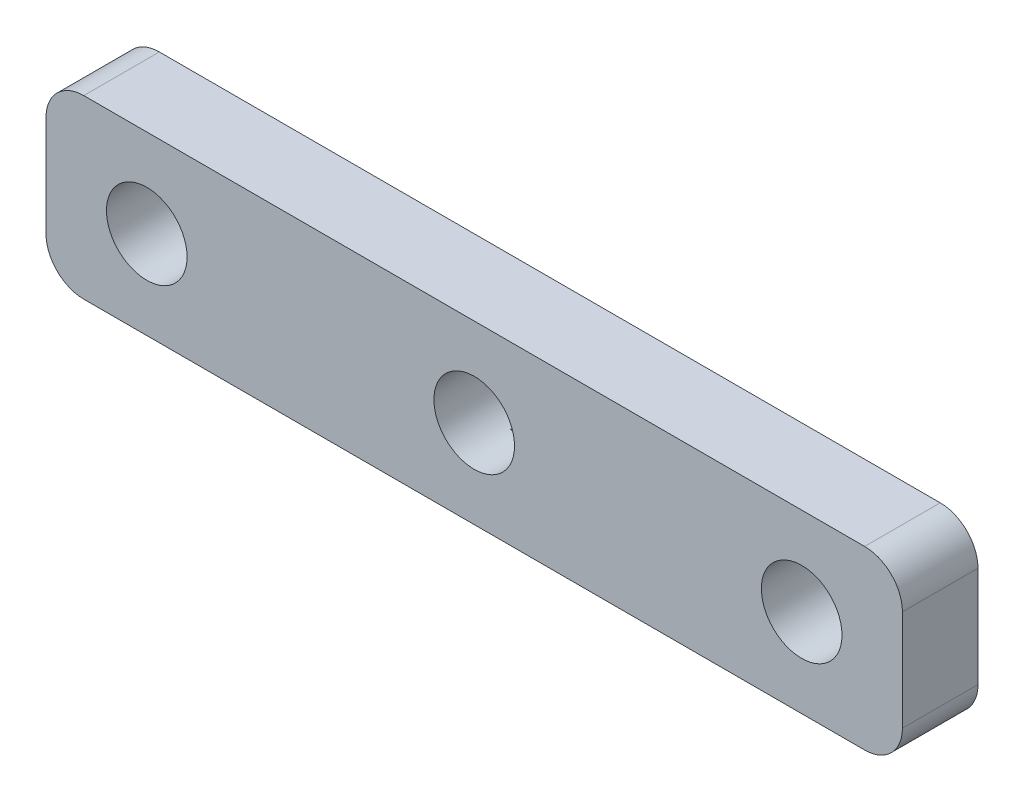
ISO-10303-21;
HEADER;
FILE_DESCRIPTION(('STEP AP214'),'2;1');
FILE_NAME('part.step','',(''),(''),'','','');
FILE_SCHEMA(('AUTOMOTIVE_DESIGN { 1 0 10303 214 1 1 1 1 }'));
ENDSEC;
DATA;
#1=APPLICATION_CONTEXT('core data for automotive mechanical design processes');
#2=APPLICATION_PROTOCOL_DEFINITION('international standard','automotive_design',2000,#1);
#3=PRODUCT_CONTEXT('',#1,'mechanical');
#4=PRODUCT('Part','Part','',(#3));
#5=PRODUCT_RELATED_PRODUCT_CATEGORY('part','',(#4));
#6=PRODUCT_DEFINITION_FORMATION('','',#4);
#7=PRODUCT_DEFINITION_CONTEXT('part definition',#1,'design');
#8=PRODUCT_DEFINITION('design','',#6,#7);
#9=PRODUCT_DEFINITION_SHAPE('','',#8);
#10=(LENGTH_UNIT() NAMED_UNIT(*) SI_UNIT(.MILLI.,.METRE.));
#11=(NAMED_UNIT(*) PLANE_ANGLE_UNIT() SI_UNIT($,.RADIAN.));
#12=(NAMED_UNIT(*) SI_UNIT($,.STERADIAN.) SOLID_ANGLE_UNIT());
#13=UNCERTAINTY_MEASURE_WITH_UNIT(LENGTH_MEASURE(1.E-05),#10,'distance_accuracy_value','');
#14=(GEOMETRIC_REPRESENTATION_CONTEXT(3) GLOBAL_UNCERTAINTY_ASSIGNED_CONTEXT((#13)) GLOBAL_UNIT_ASSIGNED_CONTEXT((#10,
#11,#12)) REPRESENTATION_CONTEXT('',''));
#15=CARTESIAN_POINT('',(0.,0.,0.));
#16=DIRECTION('',(0.,0.,1.));
#17=DIRECTION('',(1.,0.,0.));
#18=AXIS2_PLACEMENT_3D('',#15,#16,#17);
#19=CARTESIAN_POINT('',(0.,0.,3.));
#20=DIRECTION('',(0.,0.,-1.));
#21=DIRECTION('',(-1.,0.,0.));
#22=AXIS2_PLACEMENT_3D('',#19,#20,#21);
#23=PLANE('',#22);
#24=DIRECTION('',(0.,-1.,0.));
#25=VECTOR('',#24,1.);
#26=CARTESIAN_POINT('',(0.,0.,3.));
#27=LINE('',#26,#25);
#28=CARTESIAN_POINT('',(0.,5.5,3.));
#29=VERTEX_POINT('',#28);
#30=CARTESIAN_POINT('',(0.,1.5,3.));
#31=VERTEX_POINT('',#30);
#32=EDGE_CURVE('E354',#29,#31,#27,.T.);
#33=ORIENTED_EDGE('',*,*,#32,.T.);
#34=CARTESIAN_POINT('',(1.5,1.5,3.));
#35=DIRECTION('',(0.,0.,-1.));
#36=DIRECTION('',(-1.,0.,0.));
#37=AXIS2_PLACEMENT_3D('',#34,#35,#36);
#38=CIRCLE('',#37,1.5);
#39=CARTESIAN_POINT('',(1.5,0.,3.));
#40=VERTEX_POINT('',#39);
#41=EDGE_CURVE('E425',#31,#40,#38,.F.);
#42=ORIENTED_EDGE('',*,*,#41,.T.);
#43=DIRECTION('',(1.,0.,0.));
#44=VECTOR('',#43,1.);
#45=CARTESIAN_POINT('',(0.,0.,3.));
#46=LINE('',#45,#44);
#47=CARTESIAN_POINT('',(32.5000000000008,0.,3.));
#48=VERTEX_POINT('',#47);
#49=EDGE_CURVE('E357',#40,#48,#46,.T.);
#50=ORIENTED_EDGE('',*,*,#49,.T.);
#51=CARTESIAN_POINT('',(32.5000000000008,1.5,3.));
#52=DIRECTION('',(0.,0.,-1.));
#53=DIRECTION('',(-1.,0.,0.));
#54=AXIS2_PLACEMENT_3D('',#51,#52,#53);
#55=CIRCLE('',#54,1.5);
#56=CARTESIAN_POINT('',(34.0000000000008,1.5,3.));
#57=VERTEX_POINT('',#56);
#58=EDGE_CURVE('E421',#48,#57,#55,.F.);
#59=ORIENTED_EDGE('',*,*,#58,.T.);
#60=DIRECTION('',(0.,1.,0.));
#61=VECTOR('',#60,1.);
#62=CARTESIAN_POINT('',(34.0000000000008,0.,3.));
#63=LINE('',#62,#61);
#64=CARTESIAN_POINT('',(34.0000000000008,5.5,3.));
#65=VERTEX_POINT('',#64);
#66=EDGE_CURVE('E361',#57,#65,#63,.T.);
#67=ORIENTED_EDGE('',*,*,#66,.T.);
#68=CARTESIAN_POINT('',(32.5000000000008,5.5,3.));
#69=DIRECTION('',(0.,0.,-1.));
#70=DIRECTION('',(-1.,0.,0.));
#71=AXIS2_PLACEMENT_3D('',#68,#69,#70);
#72=CIRCLE('',#71,1.5);
#73=CARTESIAN_POINT('',(32.5000000000008,7.,3.));
#74=VERTEX_POINT('',#73);
#75=EDGE_CURVE('E55',#65,#74,#72,.F.);
#76=ORIENTED_EDGE('',*,*,#75,.T.);
#77=DIRECTION('',(-1.,0.,0.));
#78=VECTOR('',#77,1.);
#79=CARTESIAN_POINT('',(0.,7.,3.));
#80=LINE('',#79,#78);
#81=CARTESIAN_POINT('',(1.5,7.,3.));
#82=VERTEX_POINT('',#81);
#83=EDGE_CURVE('E363',#74,#82,#80,.T.);
#84=ORIENTED_EDGE('',*,*,#83,.T.);
#85=CARTESIAN_POINT('',(1.5,5.5,3.));
#86=DIRECTION('',(0.,0.,-1.));
#87=DIRECTION('',(-1.,0.,0.));
#88=AXIS2_PLACEMENT_3D('',#85,#86,#87);
#89=CIRCLE('',#88,1.5);
#90=EDGE_CURVE('E423',#82,#29,#89,.F.);
#91=ORIENTED_EDGE('',*,*,#90,.T.);
#92=EDGE_LOOP('',(#33,#42,#50,#59,#67,#76,#84,#91));
#93=FACE_BOUND('',#92,.T.);
#94=CARTESIAN_POINT('',(3.99999999999866,3.50000000000078,3.));
#95=DIRECTION('',(0.,0.,1.));
#96=DIRECTION('',(1.,0.,0.));
#97=AXIS2_PLACEMENT_3D('',#94,#95,#96);
#98=CIRCLE('',#97,1.60000000000105);
#99=CARTESIAN_POINT('',(5.59999999999971,3.50000000000078,3.));
#100=VERTEX_POINT('',#99);
#101=EDGE_CURVE('E348',#100,#100,#98,.T.);
#102=ORIENTED_EDGE('',*,*,#101,.F.);
#103=EDGE_LOOP('',(#102));
#104=FACE_BOUND('',#103,.T.);
#105=CARTESIAN_POINT('',(29.9999999999987,3.50000000000078,3.));
#106=DIRECTION('',(0.,0.,1.));
#107=DIRECTION('',(1.,0.,0.));
#108=AXIS2_PLACEMENT_3D('',#105,#106,#107);
#109=CIRCLE('',#108,1.60000000000105);
#110=CARTESIAN_POINT('',(31.5999999999997,3.50000000000078,3.));
#111=VERTEX_POINT('',#110);
#112=EDGE_CURVE('E342',#111,#111,#109,.T.);
#113=ORIENTED_EDGE('',*,*,#112,.F.);
#114=EDGE_LOOP('',(#113));
#115=FACE_BOUND('',#114,.T.);
#116=CARTESIAN_POINT('',(16.9999999999987,3.50000000000078,3.));
#117=DIRECTION('',(0.,0.,1.));
#118=DIRECTION('',(1.,0.,0.));
#119=AXIS2_PLACEMENT_3D('',#116,#117,#118);
#120=CIRCLE('',#119,1.60000000000105);
#121=CARTESIAN_POINT('',(18.5999999999997,3.50000000000078,3.));
#122=VERTEX_POINT('',#121);
#123=EDGE_CURVE('E334',#122,#122,#120,.T.);
#124=ORIENTED_EDGE('',*,*,#123,.F.);
#125=EDGE_LOOP('',(#124));
#126=FACE_BOUND('',#125,.T.);
#127=ADVANCED_FACE('F33',(#93,#104,#115,#126),#23,.F.);
#128=CARTESIAN_POINT('',(0.,0.,0.));
#129=DIRECTION('',(0.,0.,-1.));
#130=DIRECTION('',(-1.,0.,0.));
#131=AXIS2_PLACEMENT_3D('',#128,#129,#130);
#132=PLANE('',#131);
#133=DIRECTION('',(-1.,0.,0.));
#134=VECTOR('',#133,1.);
#135=CARTESIAN_POINT('',(26.0000000000008,5.,0.));
#136=LINE('',#135,#134);
#137=CARTESIAN_POINT('',(26.0000000000008,5.,0.));
#138=VERTEX_POINT('',#137);
#139=CARTESIAN_POINT('',(17.5567764362868,5.,0.));
#140=VERTEX_POINT('',#139);
#141=EDGE_CURVE('E252',#138,#140,#136,.T.);
#142=ORIENTED_EDGE('',*,*,#141,.F.);
#143=DIRECTION('',(0.,-1.,0.));
#144=VECTOR('',#143,1.);
#145=CARTESIAN_POINT('',(26.0000000000008,5.,0.));
#146=LINE('',#145,#144);
#147=CARTESIAN_POINT('',(26.0000000000008,6.,0.));
#148=VERTEX_POINT('',#147);
#149=EDGE_CURVE('E231',#148,#138,#146,.T.);
#150=ORIENTED_EDGE('',*,*,#149,.F.);
#151=DIRECTION('',(1.,0.,0.));
#152=VECTOR('',#151,1.);
#153=CARTESIAN_POINT('',(26.0000000000008,6.,0.));
#154=LINE('',#153,#152);
#155=CARTESIAN_POINT('',(8.,6.00000000000001,0.));
#156=VERTEX_POINT('',#155);
#157=EDGE_CURVE('E256',#156,#148,#154,.T.);
#158=ORIENTED_EDGE('',*,*,#157,.F.);
#159=DIRECTION('',(0.,1.,0.));
#160=VECTOR('',#159,1.);
#161=CARTESIAN_POINT('',(8.,5.,0.));
#162=LINE('',#161,#160);
#163=CARTESIAN_POINT('',(8.,5.,0.));
#164=VERTEX_POINT('',#163);
#165=EDGE_CURVE('E254',#164,#156,#162,.T.);
#166=ORIENTED_EDGE('',*,*,#165,.F.);
#167=CARTESIAN_POINT('',(16.4432235637105,5.,0.));
#168=VERTEX_POINT('',#167);
#169=EDGE_CURVE('E237',#168,#164,#136,.T.);
#170=ORIENTED_EDGE('',*,*,#169,.F.);
#171=CARTESIAN_POINT('',(16.9999999999987,3.50000000000078,0.));
#172=DIRECTION('',(0.,0.,1.));
#173=DIRECTION('',(1.,0.,0.));
#174=AXIS2_PLACEMENT_3D('',#171,#172,#173);
#175=CIRCLE('',#174,1.60000000000105);
#176=CARTESIAN_POINT('',(15.4801315846402,4.,0.));
#177=VERTEX_POINT('',#176);
#178=EDGE_CURVE('E341',#168,#177,#175,.T.);
#179=ORIENTED_EDGE('',*,*,#178,.T.);
#180=DIRECTION('',(1.,0.,0.));
#181=VECTOR('',#180,1.);
#182=CARTESIAN_POINT('',(26.0000000000008,4.,0.));
#183=LINE('',#182,#181);
#184=CARTESIAN_POINT('',(8.,4.00000000000001,0.));
#185=VERTEX_POINT('',#184);
#186=EDGE_CURVE('E287',#185,#177,#183,.T.);
#187=ORIENTED_EDGE('',*,*,#186,.F.);
#188=DIRECTION('',(0.,1.,0.));
#189=VECTOR('',#188,1.);
#190=CARTESIAN_POINT('',(8.,3.,0.));
#191=LINE('',#190,#189);
#192=CARTESIAN_POINT('',(8.,3.,0.));
#193=VERTEX_POINT('',#192);
#194=EDGE_CURVE('E282',#193,#185,#191,.T.);
#195=ORIENTED_EDGE('',*,*,#194,.F.);
#196=DIRECTION('',(-1.,0.,0.));
#197=VECTOR('',#196,1.);
#198=CARTESIAN_POINT('',(26.0000000000008,3.,0.));
#199=LINE('',#198,#197);
#200=CARTESIAN_POINT('',(15.4801315846407,3.,0.));
#201=VERTEX_POINT('',#200);
#202=EDGE_CURVE('E283',#201,#193,#199,.T.);
#203=ORIENTED_EDGE('',*,*,#202,.F.);
#204=CARTESIAN_POINT('',(16.4432235637147,2.,0.));
#205=VERTEX_POINT('',#204);
#206=EDGE_CURVE('E767',#201,#205,#175,.T.);
#207=ORIENTED_EDGE('',*,*,#206,.T.);
#208=DIRECTION('',(1.,0.,0.));
#209=VECTOR('',#208,1.);
#210=CARTESIAN_POINT('',(26.0000000000008,2.,0.));
#211=LINE('',#210,#209);
#212=CARTESIAN_POINT('',(8.,2.00000000000001,0.));
#213=VERTEX_POINT('',#212);
#214=EDGE_CURVE('E322',#213,#205,#211,.T.);
#215=ORIENTED_EDGE('',*,*,#214,.F.);
#216=DIRECTION('',(0.,1.,0.));
#217=VECTOR('',#216,1.);
#218=CARTESIAN_POINT('',(8.,1.,0.));
#219=LINE('',#218,#217);
#220=CARTESIAN_POINT('',(8.,1.,0.));
#221=VERTEX_POINT('',#220);
#222=EDGE_CURVE('E318',#221,#213,#219,.T.);
#223=ORIENTED_EDGE('',*,*,#222,.F.);
#224=DIRECTION('',(-1.,0.,0.));
#225=VECTOR('',#224,1.);
#226=CARTESIAN_POINT('',(26.0000000000008,1.,0.));
#227=LINE('',#226,#225);
#228=CARTESIAN_POINT('',(26.0000000000008,1.,0.));
#229=VERTEX_POINT('',#228);
#230=EDGE_CURVE('E315',#229,#221,#227,.T.);
#231=ORIENTED_EDGE('',*,*,#230,.F.);
#232=DIRECTION('',(0.,-1.,0.));
#233=VECTOR('',#232,1.);
#234=CARTESIAN_POINT('',(26.0000000000008,1.,0.));
#235=LINE('',#234,#233);
#236=CARTESIAN_POINT('',(26.0000000000008,2.,0.));
#237=VERTEX_POINT('',#236);
#238=EDGE_CURVE('E305',#237,#229,#235,.T.);
#239=ORIENTED_EDGE('',*,*,#238,.F.);
#240=CARTESIAN_POINT('',(17.5567764362826,2.,0.));
#241=VERTEX_POINT('',#240);
#242=EDGE_CURVE('E321',#241,#237,#211,.T.);
#243=ORIENTED_EDGE('',*,*,#242,.F.);
#244=CARTESIAN_POINT('',(18.5198684153566,3.,0.));
#245=VERTEX_POINT('',#244);
#246=EDGE_CURVE('E263',#241,#245,#175,.T.);
#247=ORIENTED_EDGE('',*,*,#246,.T.);
#248=CARTESIAN_POINT('',(26.0000000000008,3.,0.));
#249=VERTEX_POINT('',#248);
#250=EDGE_CURVE('E280',#249,#245,#199,.T.);
#251=ORIENTED_EDGE('',*,*,#250,.F.);
#252=DIRECTION('',(0.,-1.,0.));
#253=VECTOR('',#252,1.);
#254=CARTESIAN_POINT('',(26.0000000000008,3.,0.));
#255=LINE('',#254,#253);
#256=CARTESIAN_POINT('',(26.0000000000008,4.,0.));
#257=VERTEX_POINT('',#256);
#258=EDGE_CURVE('E289',#257,#249,#255,.T.);
#259=ORIENTED_EDGE('',*,*,#258,.F.);
#260=CARTESIAN_POINT('',(18.5198684153571,4.,0.));
#261=VERTEX_POINT('',#260);
#262=EDGE_CURVE('E286',#261,#257,#183,.T.);
#263=ORIENTED_EDGE('',*,*,#262,.F.);
#264=EDGE_CURVE('E338',#261,#140,#175,.T.);
#265=ORIENTED_EDGE('',*,*,#264,.T.);
#266=EDGE_LOOP('',(#142,#150,#158,#166,#170,#179,#187,#195,#203,#207,#215,#223,#231,#239,#243,
#247,#251,#259,#263,#265));
#267=FACE_BOUND('',#266,.T.);
#268=CARTESIAN_POINT('',(29.9999999999987,3.50000000000078,0.));
#269=DIRECTION('',(0.,0.,1.));
#270=DIRECTION('',(1.,0.,0.));
#271=AXIS2_PLACEMENT_3D('',#268,#269,#270);
#272=CIRCLE('',#271,1.60000000000105);
#273=CARTESIAN_POINT('',(31.5999999999997,3.50000000000078,0.));
#274=VERTEX_POINT('',#273);
#275=EDGE_CURVE('E337',#274,#274,#272,.T.);
#276=ORIENTED_EDGE('',*,*,#275,.T.);
#277=EDGE_LOOP('',(#276));
#278=FACE_BOUND('',#277,.T.);
#279=DIRECTION('',(1.,0.,0.));
#280=VECTOR('',#279,1.);
#281=CARTESIAN_POINT('',(0.,0.,0.));
#282=LINE('',#281,#280);
#283=CARTESIAN_POINT('',(1.5,0.,0.));
#284=VERTEX_POINT('',#283);
#285=CARTESIAN_POINT('',(32.5000000000008,0.,0.));
#286=VERTEX_POINT('',#285);
#287=EDGE_CURVE('E368',#284,#286,#282,.T.);
#288=ORIENTED_EDGE('',*,*,#287,.F.);
#289=CARTESIAN_POINT('',(1.5,1.5,0.));
#290=DIRECTION('',(0.,0.,-1.));
#291=DIRECTION('',(-1.,0.,0.));
#292=AXIS2_PLACEMENT_3D('',#289,#290,#291);
#293=CIRCLE('',#292,1.5);
#294=CARTESIAN_POINT('',(0.,1.5,0.));
#295=VERTEX_POINT('',#294);
#296=EDGE_CURVE('E413',#284,#295,#293,.T.);
#297=ORIENTED_EDGE('',*,*,#296,.T.);
#298=DIRECTION('',(0.,-1.,0.));
#299=VECTOR('',#298,1.);
#300=CARTESIAN_POINT('',(0.,0.,0.));
#301=LINE('',#300,#299);
#302=CARTESIAN_POINT('',(0.,5.5,0.));
#303=VERTEX_POINT('',#302);
#304=EDGE_CURVE('E351',#303,#295,#301,.T.);
#305=ORIENTED_EDGE('',*,*,#304,.F.);
#306=CARTESIAN_POINT('',(1.5,5.5,0.));
#307=DIRECTION('',(0.,0.,-1.));
#308=DIRECTION('',(-1.,0.,0.));
#309=AXIS2_PLACEMENT_3D('',#306,#307,#308);
#310=CIRCLE('',#309,1.5);
#311=CARTESIAN_POINT('',(1.5,7.,0.));
#312=VERTEX_POINT('',#311);
#313=EDGE_CURVE('E411',#303,#312,#310,.T.);
#314=ORIENTED_EDGE('',*,*,#313,.T.);
#315=DIRECTION('',(-1.,0.,0.));
#316=VECTOR('',#315,1.);
#317=CARTESIAN_POINT('',(0.,7.,0.));
#318=LINE('',#317,#316);
#319=CARTESIAN_POINT('',(32.5000000000008,7.,0.));
#320=VERTEX_POINT('',#319);
#321=EDGE_CURVE('E358',#320,#312,#318,.T.);
#322=ORIENTED_EDGE('',*,*,#321,.F.);
#323=CARTESIAN_POINT('',(32.5000000000008,5.5,0.));
#324=DIRECTION('',(0.,0.,-1.));
#325=DIRECTION('',(-1.,0.,0.));
#326=AXIS2_PLACEMENT_3D('',#323,#324,#325);
#327=CIRCLE('',#326,1.5);
#328=CARTESIAN_POINT('',(34.0000000000008,5.5,0.));
#329=VERTEX_POINT('',#328);
#330=EDGE_CURVE('E407',#320,#329,#327,.T.);
#331=ORIENTED_EDGE('',*,*,#330,.T.);
#332=DIRECTION('',(0.,1.,0.));
#333=VECTOR('',#332,1.);
#334=CARTESIAN_POINT('',(34.0000000000008,0.,0.));
#335=LINE('',#334,#333);
#336=CARTESIAN_POINT('',(34.0000000000008,1.5,0.));
#337=VERTEX_POINT('',#336);
#338=EDGE_CURVE('E371',#337,#329,#335,.T.);
#339=ORIENTED_EDGE('',*,*,#338,.F.);
#340=CARTESIAN_POINT('',(32.5000000000008,1.5,0.));
#341=DIRECTION('',(0.,0.,-1.));
#342=DIRECTION('',(-1.,0.,0.));
#343=AXIS2_PLACEMENT_3D('',#340,#341,#342);
#344=CIRCLE('',#343,1.5);
#345=EDGE_CURVE('E409',#337,#286,#344,.T.);
#346=ORIENTED_EDGE('',*,*,#345,.T.);
#347=EDGE_LOOP('',(#288,#297,#305,#314,#322,#331,#339,#346));
#348=FACE_BOUND('',#347,.T.);
#349=CARTESIAN_POINT('',(3.99999999999866,3.50000000000078,0.));
#350=DIRECTION('',(0.,0.,1.));
#351=DIRECTION('',(1.,0.,0.));
#352=AXIS2_PLACEMENT_3D('',#349,#350,#351);
#353=CIRCLE('',#352,1.60000000000105);
#354=CARTESIAN_POINT('',(5.59999999999971,3.50000000000078,0.));
#355=VERTEX_POINT('',#354);
#356=EDGE_CURVE('E345',#355,#355,#353,.T.);
#357=ORIENTED_EDGE('',*,*,#356,.T.);
#358=EDGE_LOOP('',(#357));
#359=FACE_BOUND('',#358,.T.);
#360=ADVANCED_FACE('F444',(#267,#278,#348,#359),#132,.T.);
#361=CARTESIAN_POINT('',(0.,0.,3.));
#362=DIRECTION('',(1.,0.,0.));
#363=DIRECTION('',(0.,0.,-1.));
#364=AXIS2_PLACEMENT_3D('',#361,#362,#363);
#365=PLANE('',#364);
#366=ORIENTED_EDGE('',*,*,#304,.T.);
#367=DIRECTION('',(0.,0.,-1.));
#368=VECTOR('',#367,1.);
#369=CARTESIAN_POINT('',(0.,1.5,3.));
#370=LINE('',#369,#368);
#371=EDGE_CURVE('E418',#295,#31,#370,.F.);
#372=ORIENTED_EDGE('',*,*,#371,.T.);
#373=ORIENTED_EDGE('',*,*,#32,.F.);
#374=DIRECTION('',(0.,0.,-1.));
#375=VECTOR('',#374,1.);
#376=CARTESIAN_POINT('',(0.,5.5,3.));
#377=LINE('',#376,#375);
#378=EDGE_CURVE('E415',#29,#303,#377,.T.);
#379=ORIENTED_EDGE('',*,*,#378,.T.);
#380=EDGE_LOOP('',(#366,#372,#373,#379));
#381=FACE_BOUND('',#380,.T.);
#382=ADVANCED_FACE('F453',(#381),#365,.F.);
#383=CARTESIAN_POINT('',(0.,0.,3.));
#384=DIRECTION('',(0.,1.,0.));
#385=DIRECTION('',(0.,0.,1.));
#386=AXIS2_PLACEMENT_3D('',#383,#384,#385);
#387=PLANE('',#386);
#388=ORIENTED_EDGE('',*,*,#49,.F.);
#389=DIRECTION('',(0.,0.,-1.));
#390=VECTOR('',#389,1.);
#391=CARTESIAN_POINT('',(1.5,0.,3.));
#392=LINE('',#391,#390);
#393=EDGE_CURVE('E404',#40,#284,#392,.T.);
#394=ORIENTED_EDGE('',*,*,#393,.T.);
#395=ORIENTED_EDGE('',*,*,#287,.T.);
#396=DIRECTION('',(0.,0.,-1.));
#397=VECTOR('',#396,1.);
#398=CARTESIAN_POINT('',(32.5000000000008,0.,3.));
#399=LINE('',#398,#397);
#400=EDGE_CURVE('E402',#286,#48,#399,.F.);
#401=ORIENTED_EDGE('',*,*,#400,.T.);
#402=EDGE_LOOP('',(#388,#394,#395,#401));
#403=FACE_BOUND('',#402,.T.);
#404=ADVANCED_FACE('F461',(#403),#387,.F.);
#405=CARTESIAN_POINT('',(34.0000000000008,0.,3.));
#406=DIRECTION('',(-1.,0.,0.));
#407=DIRECTION('',(0.,0.,1.));
#408=AXIS2_PLACEMENT_3D('',#405,#406,#407);
#409=PLANE('',#408);
#410=ORIENTED_EDGE('',*,*,#66,.F.);
#411=DIRECTION('',(0.,0.,-1.));
#412=VECTOR('',#411,1.);
#413=CARTESIAN_POINT('',(34.0000000000008,1.5,3.));
#414=LINE('',#413,#412);
#415=EDGE_CURVE('E11',#57,#337,#414,.T.);
#416=ORIENTED_EDGE('',*,*,#415,.T.);
#417=ORIENTED_EDGE('',*,*,#338,.T.);
#418=DIRECTION('',(0.,0.,-1.));
#419=VECTOR('',#418,1.);
#420=CARTESIAN_POINT('',(34.0000000000008,5.5,3.));
#421=LINE('',#420,#419);
#422=EDGE_CURVE('E41',#329,#65,#421,.F.);
#423=ORIENTED_EDGE('',*,*,#422,.T.);
#424=EDGE_LOOP('',(#410,#416,#417,#423));
#425=FACE_BOUND('',#424,.T.);
#426=ADVANCED_FACE('F433',(#425),#409,.F.);
#427=CARTESIAN_POINT('',(0.,7.,3.));
#428=DIRECTION('',(0.,-1.,0.));
#429=DIRECTION('',(0.,0.,-1.));
#430=AXIS2_PLACEMENT_3D('',#427,#428,#429);
#431=PLANE('',#430);
#432=ORIENTED_EDGE('',*,*,#321,.T.);
#433=DIRECTION('',(0.,0.,-1.));
#434=VECTOR('',#433,1.);
#435=CARTESIAN_POINT('',(1.5,7.,3.));
#436=LINE('',#435,#434);
#437=EDGE_CURVE('E48',#312,#82,#436,.F.);
#438=ORIENTED_EDGE('',*,*,#437,.T.);
#439=ORIENTED_EDGE('',*,*,#83,.F.);
#440=DIRECTION('',(0.,0.,-1.));
#441=VECTOR('',#440,1.);
#442=CARTESIAN_POINT('',(32.5000000000008,7.,3.));
#443=LINE('',#442,#441);
#444=EDGE_CURVE('E427',#74,#320,#443,.T.);
#445=ORIENTED_EDGE('',*,*,#444,.T.);
#446=EDGE_LOOP('',(#432,#438,#439,#445));
#447=FACE_BOUND('',#446,.T.);
#448=ADVANCED_FACE('F441',(#447),#431,.F.);
#449=CARTESIAN_POINT('',(3.99999999999866,3.50000000000078,3.));
#450=DIRECTION('',(0.,0.,-1.));
#451=DIRECTION('',(-1.,0.,0.));
#452=AXIS2_PLACEMENT_3D('',#449,#450,#451);
#453=CYLINDRICAL_SURFACE('',#452,1.60000000000105);
#454=ORIENTED_EDGE('',*,*,#101,.T.);
#455=EDGE_LOOP('',(#454));
#456=FACE_BOUND('',#455,.T.);
#457=ORIENTED_EDGE('',*,*,#356,.F.);
#458=EDGE_LOOP('',(#457));
#459=FACE_BOUND('',#458,.T.);
#460=ADVANCED_FACE('F479',(#456,#459),#453,.F.);
#461=CARTESIAN_POINT('',(29.9999999999987,3.50000000000078,3.));
#462=DIRECTION('',(0.,0.,-1.));
#463=DIRECTION('',(-1.,0.,0.));
#464=AXIS2_PLACEMENT_3D('',#461,#462,#463);
#465=CYLINDRICAL_SURFACE('',#464,1.60000000000105);
#466=ORIENTED_EDGE('',*,*,#112,.T.);
#467=EDGE_LOOP('',(#466));
#468=FACE_BOUND('',#467,.T.);
#469=ORIENTED_EDGE('',*,*,#275,.F.);
#470=EDGE_LOOP('',(#469));
#471=FACE_BOUND('',#470,.T.);
#472=ADVANCED_FACE('F558',(#468,#471),#465,.F.);
#473=CARTESIAN_POINT('',(16.9999999999987,3.50000000000078,3.));
#474=DIRECTION('',(0.,0.,-1.));
#475=DIRECTION('',(-1.,0.,0.));
#476=AXIS2_PLACEMENT_3D('',#473,#474,#475);
#477=CYLINDRICAL_SURFACE('',#476,1.60000000000105);
#478=DIRECTION('',(0.,0.,-1.));
#479=VECTOR('',#478,1.);
#480=CARTESIAN_POINT('',(16.4432235637105,5.,3.));
#481=LINE('',#480,#479);
#482=CARTESIAN_POINT('',(16.4432235637105,5.,1.));
#483=VERTEX_POINT('',#482);
#484=EDGE_CURVE('E400',#483,#168,#481,.T.);
#485=ORIENTED_EDGE('',*,*,#484,.F.);
#486=CARTESIAN_POINT('',(16.9999999999987,3.50000000000078,1.));
#487=DIRECTION('',(0.,0.,-1.));
#488=DIRECTION('',(-1.,0.,0.));
#489=AXIS2_PLACEMENT_3D('',#486,#487,#488);
#490=CIRCLE('',#489,1.60000000000105);
#491=CARTESIAN_POINT('',(17.5567764362868,5.,1.));
#492=VERTEX_POINT('',#491);
#493=EDGE_CURVE('E227',#483,#492,#490,.T.);
#494=ORIENTED_EDGE('',*,*,#493,.T.);
#495=DIRECTION('',(0.,0.,-1.));
#496=VECTOR('',#495,1.);
#497=CARTESIAN_POINT('',(17.5567764362868,5.,3.));
#498=LINE('',#497,#496);
#499=EDGE_CURVE('E397',#140,#492,#498,.F.);
#500=ORIENTED_EDGE('',*,*,#499,.F.);
#501=ORIENTED_EDGE('',*,*,#264,.F.);
#502=DIRECTION('',(0.,0.,-1.));
#503=VECTOR('',#502,1.);
#504=CARTESIAN_POINT('',(18.5198684153571,4.,3.));
#505=LINE('',#504,#503);
#506=CARTESIAN_POINT('',(18.5198684153571,4.,1.));
#507=VERTEX_POINT('',#506);
#508=EDGE_CURVE('E391',#507,#261,#505,.T.);
#509=ORIENTED_EDGE('',*,*,#508,.F.);
#510=CARTESIAN_POINT('',(16.9999999999987,3.50000000000078,1.));
#511=DIRECTION('',(0.,0.,-1.));
#512=DIRECTION('',(-1.,0.,0.));
#513=AXIS2_PLACEMENT_3D('',#510,#511,#512);
#514=CIRCLE('',#513,1.60000000000105);
#515=CARTESIAN_POINT('',(18.5198684153566,3.,1.));
#516=VERTEX_POINT('',#515);
#517=EDGE_CURVE('E386',#507,#516,#514,.T.);
#518=ORIENTED_EDGE('',*,*,#517,.T.);
#519=DIRECTION('',(0.,0.,-1.));
#520=VECTOR('',#519,1.);
#521=CARTESIAN_POINT('',(18.5198684153566,3.,3.));
#522=LINE('',#521,#520);
#523=EDGE_CURVE('E393',#245,#516,#522,.F.);
#524=ORIENTED_EDGE('',*,*,#523,.F.);
#525=ORIENTED_EDGE('',*,*,#246,.F.);
#526=DIRECTION('',(0.,0.,-1.));
#527=VECTOR('',#526,1.);
#528=CARTESIAN_POINT('',(17.5567764362826,2.,3.));
#529=LINE('',#528,#527);
#530=CARTESIAN_POINT('',(17.5567764362826,2.,1.));
#531=VERTEX_POINT('',#530);
#532=EDGE_CURVE('E380',#531,#241,#529,.T.);
#533=ORIENTED_EDGE('',*,*,#532,.F.);
#534=CARTESIAN_POINT('',(16.9999999999987,3.50000000000078,1.));
#535=DIRECTION('',(0.,0.,-1.));
#536=DIRECTION('',(-1.,0.,0.));
#537=AXIS2_PLACEMENT_3D('',#534,#535,#536);
#538=CIRCLE('',#537,1.60000000000105);
#539=CARTESIAN_POINT('',(16.4432235637147,2.,1.));
#540=VERTEX_POINT('',#539);
#541=EDGE_CURVE('E365',#531,#540,#538,.T.);
#542=ORIENTED_EDGE('',*,*,#541,.T.);
#543=DIRECTION('',(0.,0.,-1.));
#544=VECTOR('',#543,1.);
#545=CARTESIAN_POINT('',(16.4432235637147,2.,3.));
#546=LINE('',#545,#544);
#547=EDGE_CURVE('E377',#205,#540,#546,.F.);
#548=ORIENTED_EDGE('',*,*,#547,.F.);
#549=ORIENTED_EDGE('',*,*,#206,.F.);
#550=DIRECTION('',(0.,0.,-1.));
#551=VECTOR('',#550,1.);
#552=CARTESIAN_POINT('',(15.4801315846407,3.,3.));
#553=LINE('',#552,#551);
#554=CARTESIAN_POINT('',(15.4801315846407,3.,1.));
#555=VERTEX_POINT('',#554);
#556=EDGE_CURVE('E389',#555,#201,#553,.T.);
#557=ORIENTED_EDGE('',*,*,#556,.F.);
#558=CARTESIAN_POINT('',(15.4801315846402,4.,1.));
#559=VERTEX_POINT('',#558);
#560=EDGE_CURVE('E382',#555,#559,#514,.T.);
#561=ORIENTED_EDGE('',*,*,#560,.T.);
#562=DIRECTION('',(0.,0.,-1.));
#563=VECTOR('',#562,1.);
#564=CARTESIAN_POINT('',(15.4801315846402,4.,3.));
#565=LINE('',#564,#563);
#566=EDGE_CURVE('E385',#177,#559,#565,.F.);
#567=ORIENTED_EDGE('',*,*,#566,.F.);
#568=ORIENTED_EDGE('',*,*,#178,.F.);
#569=EDGE_LOOP('',(#485,#494,#500,#501,#509,#518,#524,#525,#533,#542,#548,#549,#557,#561,#567,#568));
#570=FACE_BOUND('',#569,.T.);
#571=ORIENTED_EDGE('',*,*,#123,.T.);
#572=EDGE_LOOP('',(#571));
#573=FACE_BOUND('',#572,.T.);
#574=ADVANCED_FACE('F556',(#570,#573),#477,.F.);
#575=CARTESIAN_POINT('',(26.0000000000008,2.,1.));
#576=DIRECTION('',(0.,1.,0.));
#577=DIRECTION('',(-1.,0.,0.));
#578=AXIS2_PLACEMENT_3D('',#575,#576,#577);
#579=PLANE('',#578);
#580=ORIENTED_EDGE('',*,*,#532,.T.);
#581=ORIENTED_EDGE('',*,*,#242,.T.);
#582=DIRECTION('',(0.,0.,-1.));
#583=VECTOR('',#582,1.);
#584=CARTESIAN_POINT('',(26.0000000000008,2.,1.));
#585=LINE('',#584,#583);
#586=CARTESIAN_POINT('',(26.0000000000008,2.,1.));
#587=VERTEX_POINT('',#586);
#588=EDGE_CURVE('E328',#587,#237,#585,.T.);
#589=ORIENTED_EDGE('',*,*,#588,.F.);
#590=DIRECTION('',(1.,0.,0.));
#591=VECTOR('',#590,1.);
#592=CARTESIAN_POINT('',(26.0000000000008,2.,1.));
#593=LINE('',#592,#591);
#594=EDGE_CURVE('E308',#531,#587,#593,.T.);
#595=ORIENTED_EDGE('',*,*,#594,.F.);
#596=EDGE_LOOP('',(#580,#581,#589,#595));
#597=FACE_BOUND('',#596,.T.);
#598=ADVANCED_FACE('F549',(#597),#579,.F.);
#599=CARTESIAN_POINT('',(26.0000000000008,1.,1.));
#600=DIRECTION('',(0.,-1.,0.));
#601=DIRECTION('',(0.,0.,-1.));
#602=AXIS2_PLACEMENT_3D('',#599,#600,#601);
#603=PLANE('',#602);
#604=ORIENTED_EDGE('',*,*,#230,.T.);
#605=DIRECTION('',(0.,0.,-1.));
#606=VECTOR('',#605,1.);
#607=CARTESIAN_POINT('',(8.,1.,1.));
#608=LINE('',#607,#606);
#609=CARTESIAN_POINT('',(8.,1.,1.));
#610=VERTEX_POINT('',#609);
#611=EDGE_CURVE('E314',#610,#221,#608,.T.);
#612=ORIENTED_EDGE('',*,*,#611,.F.);
#613=DIRECTION('',(-1.,0.,0.));
#614=VECTOR('',#613,1.);
#615=CARTESIAN_POINT('',(26.0000000000008,1.,1.));
#616=LINE('',#615,#614);
#617=CARTESIAN_POINT('',(26.0000000000008,1.,1.));
#618=VERTEX_POINT('',#617);
#619=EDGE_CURVE('E301',#618,#610,#616,.T.);
#620=ORIENTED_EDGE('',*,*,#619,.F.);
#621=DIRECTION('',(0.,0.,-1.));
#622=VECTOR('',#621,1.);
#623=CARTESIAN_POINT('',(26.0000000000008,1.,1.));
#624=LINE('',#623,#622);
#625=EDGE_CURVE('E326',#618,#229,#624,.T.);
#626=ORIENTED_EDGE('',*,*,#625,.T.);
#627=EDGE_LOOP('',(#604,#612,#620,#626));
#628=FACE_BOUND('',#627,.T.);
#629=ADVANCED_FACE('F544',(#628),#603,.F.);
#630=CARTESIAN_POINT('',(26.0000000000008,1.,1.));
#631=DIRECTION('',(1.,0.,0.));
#632=DIRECTION('',(0.,0.,-1.));
#633=AXIS2_PLACEMENT_3D('',#630,#631,#632);
#634=PLANE('',#633);
#635=ORIENTED_EDGE('',*,*,#238,.T.);
#636=ORIENTED_EDGE('',*,*,#625,.F.);
#637=DIRECTION('',(0.,-1.,0.));
#638=VECTOR('',#637,1.);
#639=CARTESIAN_POINT('',(26.0000000000008,1.,1.));
#640=LINE('',#639,#638);
#641=EDGE_CURVE('E311',#587,#618,#640,.T.);
#642=ORIENTED_EDGE('',*,*,#641,.F.);
#643=ORIENTED_EDGE('',*,*,#588,.T.);
#644=EDGE_LOOP('',(#635,#636,#642,#643));
#645=FACE_BOUND('',#644,.T.);
#646=ADVANCED_FACE('F540',(#645),#634,.F.);
#647=ORIENTED_EDGE('',*,*,#547,.T.);
#648=CARTESIAN_POINT('',(8.,2.00000000000001,1.));
#649=VERTEX_POINT('',#648);
#650=EDGE_CURVE('E309',#649,#540,#593,.T.);
#651=ORIENTED_EDGE('',*,*,#650,.F.);
#652=DIRECTION('',(0.,0.,-1.));
#653=VECTOR('',#652,1.);
#654=CARTESIAN_POINT('',(8.,2.00000000000001,1.));
#655=LINE('',#654,#653);
#656=EDGE_CURVE('E331',#649,#213,#655,.T.);
#657=ORIENTED_EDGE('',*,*,#656,.T.);
#658=ORIENTED_EDGE('',*,*,#214,.T.);
#659=EDGE_LOOP('',(#647,#651,#657,#658));
#660=FACE_BOUND('',#659,.T.);
#661=ADVANCED_FACE('F543',(#660),#579,.F.);
#662=CARTESIAN_POINT('',(8.,1.,1.));
#663=DIRECTION('',(-1.,0.,0.));
#664=DIRECTION('',(0.,0.,1.));
#665=AXIS2_PLACEMENT_3D('',#662,#663,#664);
#666=PLANE('',#665);
#667=ORIENTED_EDGE('',*,*,#222,.T.);
#668=ORIENTED_EDGE('',*,*,#656,.F.);
#669=DIRECTION('',(0.,1.,0.));
#670=VECTOR('',#669,1.);
#671=CARTESIAN_POINT('',(8.,1.,1.));
#672=LINE('',#671,#670);
#673=EDGE_CURVE('E304',#610,#649,#672,.T.);
#674=ORIENTED_EDGE('',*,*,#673,.F.);
#675=ORIENTED_EDGE('',*,*,#611,.T.);
#676=EDGE_LOOP('',(#667,#668,#674,#675));
#677=FACE_BOUND('',#676,.T.);
#678=ADVANCED_FACE('F538',(#677),#666,.F.);
#679=CARTESIAN_POINT('',(0.,0.,1.));
#680=DIRECTION('',(0.,0.,-1.));
#681=DIRECTION('',(-1.,0.,0.));
#682=AXIS2_PLACEMENT_3D('',#679,#680,#681);
#683=PLANE('',#682);
#684=ORIENTED_EDGE('',*,*,#594,.T.);
#685=ORIENTED_EDGE('',*,*,#641,.T.);
#686=ORIENTED_EDGE('',*,*,#619,.T.);
#687=ORIENTED_EDGE('',*,*,#673,.T.);
#688=ORIENTED_EDGE('',*,*,#650,.T.);
#689=ORIENTED_EDGE('',*,*,#541,.F.);
#690=EDGE_LOOP('',(#684,#685,#686,#687,#688,#689));
#691=FACE_BOUND('',#690,.T.);
#692=ADVANCED_FACE('F516',(#691),#683,.T.);
#693=CARTESIAN_POINT('',(0.,0.,1.));
#694=DIRECTION('',(0.,0.,-1.));
#695=DIRECTION('',(-1.,0.,0.));
#696=AXIS2_PLACEMENT_3D('',#693,#694,#695);
#697=PLANE('',#696);
#698=DIRECTION('',(-1.,0.,0.));
#699=VECTOR('',#698,1.);
#700=CARTESIAN_POINT('',(26.0000000000008,3.,1.));
#701=LINE('',#700,#699);
#702=CARTESIAN_POINT('',(8.,3.,1.));
#703=VERTEX_POINT('',#702);
#704=EDGE_CURVE('E270',#555,#703,#701,.T.);
#705=ORIENTED_EDGE('',*,*,#704,.T.);
#706=DIRECTION('',(0.,1.,0.));
#707=VECTOR('',#706,1.);
#708=CARTESIAN_POINT('',(8.,3.,1.));
#709=LINE('',#708,#707);
#710=CARTESIAN_POINT('',(8.,4.00000000000001,1.));
#711=VERTEX_POINT('',#710);
#712=EDGE_CURVE('E269',#703,#711,#709,.T.);
#713=ORIENTED_EDGE('',*,*,#712,.T.);
#714=DIRECTION('',(1.,0.,0.));
#715=VECTOR('',#714,1.);
#716=CARTESIAN_POINT('',(26.0000000000008,4.,1.));
#717=LINE('',#716,#715);
#718=EDGE_CURVE('E274',#711,#559,#717,.T.);
#719=ORIENTED_EDGE('',*,*,#718,.T.);
#720=ORIENTED_EDGE('',*,*,#560,.F.);
#721=EDGE_LOOP('',(#705,#713,#719,#720));
#722=FACE_BOUND('',#721,.T.);
#723=ADVANCED_FACE('F512',(#722),#697,.T.);
#724=CARTESIAN_POINT('',(26.0000000000008,4.,1.));
#725=DIRECTION('',(0.,1.,0.));
#726=DIRECTION('',(-1.,0.,0.));
#727=AXIS2_PLACEMENT_3D('',#724,#725,#726);
#728=PLANE('',#727);
#729=ORIENTED_EDGE('',*,*,#566,.T.);
#730=ORIENTED_EDGE('',*,*,#718,.F.);
#731=DIRECTION('',(0.,0.,-1.));
#732=VECTOR('',#731,1.);
#733=CARTESIAN_POINT('',(8.,4.00000000000001,1.));
#734=LINE('',#733,#732);
#735=EDGE_CURVE('E297',#711,#185,#734,.T.);
#736=ORIENTED_EDGE('',*,*,#735,.T.);
#737=ORIENTED_EDGE('',*,*,#186,.T.);
#738=EDGE_LOOP('',(#729,#730,#736,#737));
#739=FACE_BOUND('',#738,.T.);
#740=ADVANCED_FACE('F515',(#739),#728,.F.);
#741=CARTESIAN_POINT('',(26.0000000000008,3.,1.));
#742=DIRECTION('',(0.,-1.,0.));
#743=DIRECTION('',(0.,0.,-1.));
#744=AXIS2_PLACEMENT_3D('',#741,#742,#743);
#745=PLANE('',#744);
#746=ORIENTED_EDGE('',*,*,#556,.T.);
#747=ORIENTED_EDGE('',*,*,#202,.T.);
#748=DIRECTION('',(0.,0.,-1.));
#749=VECTOR('',#748,1.);
#750=CARTESIAN_POINT('',(8.,3.,1.));
#751=LINE('',#750,#749);
#752=EDGE_CURVE('E279',#703,#193,#751,.T.);
#753=ORIENTED_EDGE('',*,*,#752,.F.);
#754=ORIENTED_EDGE('',*,*,#704,.F.);
#755=EDGE_LOOP('',(#746,#747,#753,#754));
#756=FACE_BOUND('',#755,.T.);
#757=ADVANCED_FACE('F526',(#756),#745,.F.);
#758=CARTESIAN_POINT('',(8.,3.,1.));
#759=DIRECTION('',(-1.,0.,0.));
#760=DIRECTION('',(0.,0.,1.));
#761=AXIS2_PLACEMENT_3D('',#758,#759,#760);
#762=PLANE('',#761);
#763=ORIENTED_EDGE('',*,*,#194,.T.);
#764=ORIENTED_EDGE('',*,*,#735,.F.);
#765=ORIENTED_EDGE('',*,*,#712,.F.);
#766=ORIENTED_EDGE('',*,*,#752,.T.);
#767=EDGE_LOOP('',(#763,#764,#765,#766));
#768=FACE_BOUND('',#767,.T.);
#769=ADVANCED_FACE('F529',(#768),#762,.F.);
#770=ORIENTED_EDGE('',*,*,#508,.T.);
#771=ORIENTED_EDGE('',*,*,#262,.T.);
#772=DIRECTION('',(0.,0.,-1.));
#773=VECTOR('',#772,1.);
#774=CARTESIAN_POINT('',(26.0000000000008,4.,1.));
#775=LINE('',#774,#773);
#776=CARTESIAN_POINT('',(26.0000000000008,4.,1.));
#777=VERTEX_POINT('',#776);
#778=EDGE_CURVE('E294',#777,#257,#775,.T.);
#779=ORIENTED_EDGE('',*,*,#778,.F.);
#780=EDGE_CURVE('E273',#507,#777,#717,.T.);
#781=ORIENTED_EDGE('',*,*,#780,.F.);
#782=EDGE_LOOP('',(#770,#771,#779,#781));
#783=FACE_BOUND('',#782,.T.);
#784=ADVANCED_FACE('F528',(#783),#728,.F.);
#785=ORIENTED_EDGE('',*,*,#780,.T.);
#786=DIRECTION('',(0.,-1.,0.));
#787=VECTOR('',#786,1.);
#788=CARTESIAN_POINT('',(26.0000000000008,3.,1.));
#789=LINE('',#788,#787);
#790=CARTESIAN_POINT('',(26.0000000000008,3.,1.));
#791=VERTEX_POINT('',#790);
#792=EDGE_CURVE('E276',#777,#791,#789,.T.);
#793=ORIENTED_EDGE('',*,*,#792,.T.);
#794=EDGE_CURVE('E267',#791,#516,#701,.T.);
#795=ORIENTED_EDGE('',*,*,#794,.T.);
#796=ORIENTED_EDGE('',*,*,#517,.F.);
#797=EDGE_LOOP('',(#785,#793,#795,#796));
#798=FACE_BOUND('',#797,.T.);
#799=ADVANCED_FACE('F518',(#798),#697,.T.);
#800=ORIENTED_EDGE('',*,*,#523,.T.);
#801=ORIENTED_EDGE('',*,*,#794,.F.);
#802=DIRECTION('',(0.,0.,-1.));
#803=VECTOR('',#802,1.);
#804=CARTESIAN_POINT('',(26.0000000000008,3.,1.));
#805=LINE('',#804,#803);
#806=EDGE_CURVE('E292',#791,#249,#805,.T.);
#807=ORIENTED_EDGE('',*,*,#806,.T.);
#808=ORIENTED_EDGE('',*,*,#250,.T.);
#809=EDGE_LOOP('',(#800,#801,#807,#808));
#810=FACE_BOUND('',#809,.T.);
#811=ADVANCED_FACE('F522',(#810),#745,.F.);
#812=CARTESIAN_POINT('',(26.0000000000008,3.,1.));
#813=DIRECTION('',(1.,0.,0.));
#814=DIRECTION('',(0.,0.,-1.));
#815=AXIS2_PLACEMENT_3D('',#812,#813,#814);
#816=PLANE('',#815);
#817=ORIENTED_EDGE('',*,*,#258,.T.);
#818=ORIENTED_EDGE('',*,*,#806,.F.);
#819=ORIENTED_EDGE('',*,*,#792,.F.);
#820=ORIENTED_EDGE('',*,*,#778,.T.);
#821=EDGE_LOOP('',(#817,#818,#819,#820));
#822=FACE_BOUND('',#821,.T.);
#823=ADVANCED_FACE('F519',(#822),#816,.F.);
#824=CARTESIAN_POINT('',(26.0000000000008,5.,1.));
#825=DIRECTION('',(0.,-1.,0.));
#826=DIRECTION('',(0.,0.,-1.));
#827=AXIS2_PLACEMENT_3D('',#824,#825,#826);
#828=PLANE('',#827);
#829=ORIENTED_EDGE('',*,*,#484,.T.);
#830=ORIENTED_EDGE('',*,*,#169,.T.);
#831=DIRECTION('',(0.,0.,-1.));
#832=VECTOR('',#831,1.);
#833=CARTESIAN_POINT('',(8.,5.,1.));
#834=LINE('',#833,#832);
#835=CARTESIAN_POINT('',(8.,5.,1.));
#836=VERTEX_POINT('',#835);
#837=EDGE_CURVE('E234',#836,#164,#834,.T.);
#838=ORIENTED_EDGE('',*,*,#837,.F.);
#839=DIRECTION('',(-1.,0.,0.));
#840=VECTOR('',#839,1.);
#841=CARTESIAN_POINT('',(26.0000000000008,5.,1.));
#842=LINE('',#841,#840);
#843=EDGE_CURVE('E220',#483,#836,#842,.T.);
#844=ORIENTED_EDGE('',*,*,#843,.F.);
#845=EDGE_LOOP('',(#829,#830,#838,#844));
#846=FACE_BOUND('',#845,.T.);
#847=ADVANCED_FACE('F235',(#846),#828,.F.);
#848=ORIENTED_EDGE('',*,*,#499,.T.);
#849=CARTESIAN_POINT('',(26.0000000000008,5.,1.));
#850=VERTEX_POINT('',#849);
#851=EDGE_CURVE('E230',#850,#492,#842,.T.);
#852=ORIENTED_EDGE('',*,*,#851,.F.);
#853=DIRECTION('',(0.,0.,-1.));
#854=VECTOR('',#853,1.);
#855=CARTESIAN_POINT('',(26.0000000000008,5.,1.));
#856=LINE('',#855,#854);
#857=EDGE_CURVE('E261',#850,#138,#856,.T.);
#858=ORIENTED_EDGE('',*,*,#857,.T.);
#859=ORIENTED_EDGE('',*,*,#141,.T.);
#860=EDGE_LOOP('',(#848,#852,#858,#859));
#861=FACE_BOUND('',#860,.T.);
#862=ADVANCED_FACE('F504',(#861),#828,.F.);
#863=CARTESIAN_POINT('',(26.0000000000008,5.,1.));
#864=DIRECTION('',(1.,0.,0.));
#865=DIRECTION('',(0.,0.,-1.));
#866=AXIS2_PLACEMENT_3D('',#863,#864,#865);
#867=PLANE('',#866);
#868=ORIENTED_EDGE('',*,*,#149,.T.);
#869=ORIENTED_EDGE('',*,*,#857,.F.);
#870=DIRECTION('',(0.,-1.,0.));
#871=VECTOR('',#870,1.);
#872=CARTESIAN_POINT('',(26.0000000000008,5.,1.));
#873=LINE('',#872,#871);
#874=CARTESIAN_POINT('',(26.0000000000008,6.,1.));
#875=VERTEX_POINT('',#874);
#876=EDGE_CURVE('E242',#875,#850,#873,.T.);
#877=ORIENTED_EDGE('',*,*,#876,.F.);
#878=DIRECTION('',(0.,0.,-1.));
#879=VECTOR('',#878,1.);
#880=CARTESIAN_POINT('',(26.0000000000008,6.,1.));
#881=LINE('',#880,#879);
#882=EDGE_CURVE('E264',#875,#148,#881,.T.);
#883=ORIENTED_EDGE('',*,*,#882,.T.);
#884=EDGE_LOOP('',(#868,#869,#877,#883));
#885=FACE_BOUND('',#884,.T.);
#886=ADVANCED_FACE('F501',(#885),#867,.F.);
#887=CARTESIAN_POINT('',(26.0000000000008,6.,1.));
#888=DIRECTION('',(0.,1.,0.));
#889=DIRECTION('',(-1.,0.,0.));
#890=AXIS2_PLACEMENT_3D('',#887,#888,#889);
#891=PLANE('',#890);
#892=ORIENTED_EDGE('',*,*,#157,.T.);
#893=ORIENTED_EDGE('',*,*,#882,.F.);
#894=DIRECTION('',(1.,0.,0.));
#895=VECTOR('',#894,1.);
#896=CARTESIAN_POINT('',(26.0000000000008,6.,1.));
#897=LINE('',#896,#895);
#898=CARTESIAN_POINT('',(8.,6.00000000000001,1.));
#899=VERTEX_POINT('',#898);
#900=EDGE_CURVE('E246',#899,#875,#897,.T.);
#901=ORIENTED_EDGE('',*,*,#900,.F.);
#902=DIRECTION('',(0.,0.,-1.));
#903=VECTOR('',#902,1.);
#904=CARTESIAN_POINT('',(8.,6.00000000000001,1.));
#905=LINE('',#904,#903);
#906=EDGE_CURVE('E241',#899,#156,#905,.T.);
#907=ORIENTED_EDGE('',*,*,#906,.T.);
#908=EDGE_LOOP('',(#892,#893,#901,#907));
#909=FACE_BOUND('',#908,.T.);
#910=ADVANCED_FACE('F498',(#909),#891,.F.);
#911=CARTESIAN_POINT('',(8.,5.,1.));
#912=DIRECTION('',(-1.,0.,0.));
#913=DIRECTION('',(0.,0.,1.));
#914=AXIS2_PLACEMENT_3D('',#911,#912,#913);
#915=PLANE('',#914);
#916=ORIENTED_EDGE('',*,*,#165,.T.);
#917=ORIENTED_EDGE('',*,*,#906,.F.);
#918=DIRECTION('',(0.,1.,0.));
#919=VECTOR('',#918,1.);
#920=CARTESIAN_POINT('',(8.,5.,1.));
#921=LINE('',#920,#919);
#922=EDGE_CURVE('E225',#836,#899,#921,.T.);
#923=ORIENTED_EDGE('',*,*,#922,.F.);
#924=ORIENTED_EDGE('',*,*,#837,.T.);
#925=EDGE_LOOP('',(#916,#917,#923,#924));
#926=FACE_BOUND('',#925,.T.);
#927=ADVANCED_FACE('F244',(#926),#915,.F.);
#928=CARTESIAN_POINT('',(0.,0.,1.));
#929=DIRECTION('',(0.,0.,-1.));
#930=DIRECTION('',(-1.,0.,0.));
#931=AXIS2_PLACEMENT_3D('',#928,#929,#930);
#932=PLANE('',#931);
#933=ORIENTED_EDGE('',*,*,#843,.T.);
#934=ORIENTED_EDGE('',*,*,#922,.T.);
#935=ORIENTED_EDGE('',*,*,#900,.T.);
#936=ORIENTED_EDGE('',*,*,#876,.T.);
#937=ORIENTED_EDGE('',*,*,#851,.T.);
#938=ORIENTED_EDGE('',*,*,#493,.F.);
#939=EDGE_LOOP('',(#933,#934,#935,#936,#937,#938));
#940=FACE_BOUND('',#939,.T.);
#941=ADVANCED_FACE('F222',(#940),#932,.T.);
#942=CARTESIAN_POINT('',(1.5,1.5,3.));
#943=DIRECTION('',(0.,0.,-1.));
#944=DIRECTION('',(-1.,0.,0.));
#945=AXIS2_PLACEMENT_3D('',#942,#943,#944);
#946=CYLINDRICAL_SURFACE('',#945,1.5);
#947=ORIENTED_EDGE('',*,*,#41,.F.);
#948=ORIENTED_EDGE('',*,*,#371,.F.);
#949=ORIENTED_EDGE('',*,*,#296,.F.);
#950=ORIENTED_EDGE('',*,*,#393,.F.);
#951=EDGE_LOOP('',(#947,#948,#949,#950));
#952=FACE_BOUND('',#951,.T.);
#953=ADVANCED_FACE('F459',(#952),#946,.T.);
#954=CARTESIAN_POINT('',(1.5,5.5,3.));
#955=DIRECTION('',(0.,0.,-1.));
#956=DIRECTION('',(-1.,0.,0.));
#957=AXIS2_PLACEMENT_3D('',#954,#955,#956);
#958=CYLINDRICAL_SURFACE('',#957,1.5);
#959=ORIENTED_EDGE('',*,*,#90,.F.);
#960=ORIENTED_EDGE('',*,*,#437,.F.);
#961=ORIENTED_EDGE('',*,*,#313,.F.);
#962=ORIENTED_EDGE('',*,*,#378,.F.);
#963=EDGE_LOOP('',(#959,#960,#961,#962));
#964=FACE_BOUND('',#963,.T.);
#965=ADVANCED_FACE('F450',(#964),#958,.T.);
#966=CARTESIAN_POINT('',(32.5000000000008,1.5,3.));
#967=DIRECTION('',(0.,0.,-1.));
#968=DIRECTION('',(-1.,0.,0.));
#969=AXIS2_PLACEMENT_3D('',#966,#967,#968);
#970=CYLINDRICAL_SURFACE('',#969,1.5);
#971=ORIENTED_EDGE('',*,*,#58,.F.);
#972=ORIENTED_EDGE('',*,*,#400,.F.);
#973=ORIENTED_EDGE('',*,*,#345,.F.);
#974=ORIENTED_EDGE('',*,*,#415,.F.);
#975=EDGE_LOOP('',(#971,#972,#973,#974));
#976=FACE_BOUND('',#975,.T.);
#977=ADVANCED_FACE('F464',(#976),#970,.T.);
#978=CARTESIAN_POINT('',(32.5000000000008,5.5,3.));
#979=DIRECTION('',(0.,0.,-1.));
#980=DIRECTION('',(-1.,0.,0.));
#981=AXIS2_PLACEMENT_3D('',#978,#979,#980);
#982=CYLINDRICAL_SURFACE('',#981,1.5);
#983=ORIENTED_EDGE('',*,*,#75,.F.);
#984=ORIENTED_EDGE('',*,*,#422,.F.);
#985=ORIENTED_EDGE('',*,*,#330,.F.);
#986=ORIENTED_EDGE('',*,*,#444,.F.);
#987=EDGE_LOOP('',(#983,#984,#985,#986));
#988=FACE_BOUND('',#987,.T.);
#989=ADVANCED_FACE('F35',(#988),#982,.T.);
#990=CLOSED_SHELL('',(#127,#360,#382,#404,#426,#448,#460,#472,#574,#598,#629,#646,#661,#678,
#692,#723,#740,#757,#769,#784,#799,#811,#823,#847,#862,#886,#910,#927,#941,#953,#965,#977,#989));
#991=MANIFOLD_SOLID_BREP('B2',#990);
#992=ADVANCED_BREP_SHAPE_REPRESENTATION('',(#18,#991),#14);
#993=SHAPE_DEFINITION_REPRESENTATION(#9,#992);
ENDSEC;
END-ISO-10303-21;
